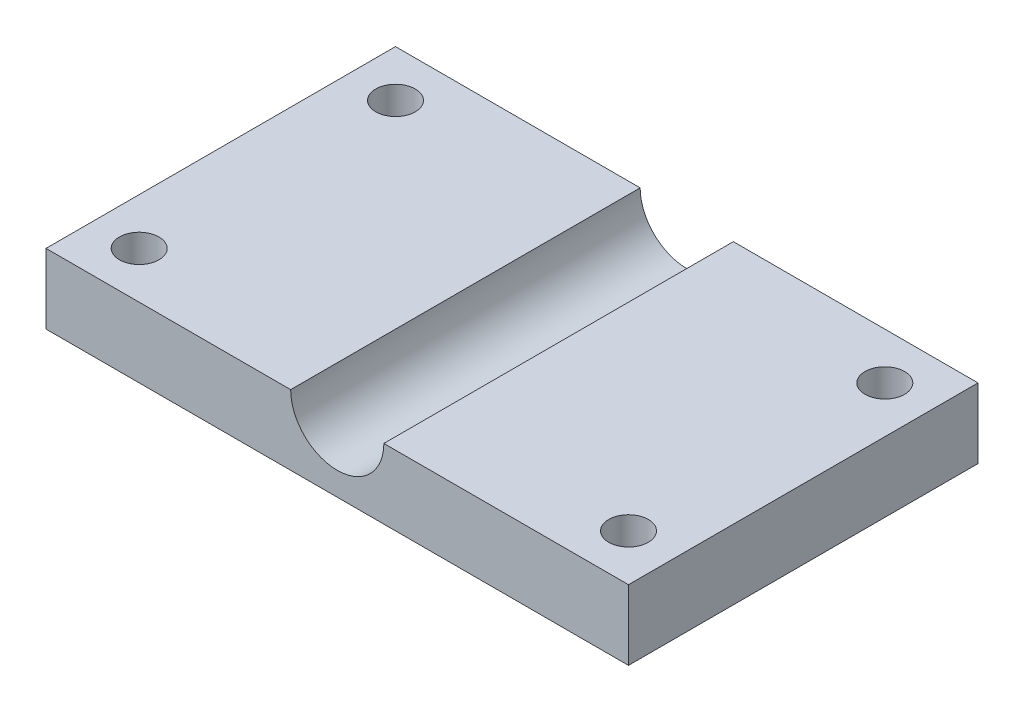
ISO-10303-21;
HEADER;
FILE_DESCRIPTION(('STEP AP214'),'2;1');
FILE_NAME('part.step','',(''),(''),'','','');
FILE_SCHEMA(('AUTOMOTIVE_DESIGN { 1 0 10303 214 1 1 1 1 }'));
ENDSEC;
DATA;
#1=APPLICATION_CONTEXT('core data for automotive mechanical design processes');
#2=APPLICATION_PROTOCOL_DEFINITION('international standard','automotive_design',2000,#1);
#3=PRODUCT_CONTEXT('',#1,'mechanical');
#4=PRODUCT('Part','Part','',(#3));
#5=PRODUCT_RELATED_PRODUCT_CATEGORY('part','',(#4));
#6=PRODUCT_DEFINITION_FORMATION('','',#4);
#7=PRODUCT_DEFINITION_CONTEXT('part definition',#1,'design');
#8=PRODUCT_DEFINITION('design','',#6,#7);
#9=PRODUCT_DEFINITION_SHAPE('','',#8);
#10=(LENGTH_UNIT() NAMED_UNIT(*) SI_UNIT(.MILLI.,.METRE.));
#11=(NAMED_UNIT(*) PLANE_ANGLE_UNIT() SI_UNIT($,.RADIAN.));
#12=(NAMED_UNIT(*) SI_UNIT($,.STERADIAN.) SOLID_ANGLE_UNIT());
#13=UNCERTAINTY_MEASURE_WITH_UNIT(LENGTH_MEASURE(1.E-05),#10,'distance_accuracy_value','');
#14=(GEOMETRIC_REPRESENTATION_CONTEXT(3) GLOBAL_UNCERTAINTY_ASSIGNED_CONTEXT((#13)) GLOBAL_UNIT_ASSIGNED_CONTEXT((#10,
#11,#12)) REPRESENTATION_CONTEXT('',''));
#15=CARTESIAN_POINT('',(0.,0.,0.));
#16=DIRECTION('',(0.,0.,1.));
#17=DIRECTION('',(1.,0.,0.));
#18=AXIS2_PLACEMENT_3D('',#15,#16,#17);
#19=CARTESIAN_POINT('',(0.,6.,0.));
#20=DIRECTION('',(0.,1.,0.));
#21=DIRECTION('',(0.,0.,1.));
#22=AXIS2_PLACEMENT_3D('',#19,#20,#21);
#23=PLANE('',#22);
#24=CARTESIAN_POINT('',(-17.7437264817021,6.,-11.7035175879397));
#25=DIRECTION('',(0.,1.,0.));
#26=DIRECTION('',(0.,0.,1.));
#27=AXIS2_PLACEMENT_3D('',#24,#25,#26);
#28=CIRCLE('',#27,1.7);
#29=CARTESIAN_POINT('',(-17.7437264817021,6.,-10.0035175879397));
#30=VERTEX_POINT('',#29);
#31=EDGE_CURVE('E208',#30,#30,#28,.T.);
#32=ORIENTED_EDGE('',*,*,#31,.F.);
#33=EDGE_LOOP('',(#32));
#34=FACE_BOUND('',#33,.T.);
#35=CARTESIAN_POINT('',(-17.7437264817021,6.,10.2964824120603));
#36=DIRECTION('',(0.,1.,0.));
#37=DIRECTION('',(0.,0.,1.));
#38=AXIS2_PLACEMENT_3D('',#35,#36,#37);
#39=CIRCLE('',#38,1.7);
#40=CARTESIAN_POINT('',(-17.7437264817021,6.,11.9964824120603));
#41=VERTEX_POINT('',#40);
#42=EDGE_CURVE('E100',#41,#41,#39,.T.);
#43=ORIENTED_EDGE('',*,*,#42,.F.);
#44=EDGE_LOOP('',(#43));
#45=FACE_BOUND('',#44,.T.);
#46=DIRECTION('',(0.,0.,1.));
#47=VECTOR('',#46,1.);
#48=CARTESIAN_POINT('',(-0.743726481702089,6.,-15.7035175879397));
#49=LINE('',#48,#47);
#50=CARTESIAN_POINT('',(-0.743726481702089,6.,-15.7035175879397));
#51=VERTEX_POINT('',#50);
#52=CARTESIAN_POINT('',(-0.743726481702089,6.,14.2964824120603));
#53=VERTEX_POINT('',#52);
#54=EDGE_CURVE('E11',#51,#53,#49,.T.);
#55=ORIENTED_EDGE('',*,*,#54,.F.);
#56=DIRECTION('',(-1.,0.,0.));
#57=VECTOR('',#56,1.);
#58=CARTESIAN_POINT('',(-21.7437264817021,6.,-15.7035175879397));
#59=LINE('',#58,#57);
#60=CARTESIAN_POINT('',(-21.7437264817021,6.,-15.7035175879397));
#61=VERTEX_POINT('',#60);
#62=EDGE_CURVE('E56',#51,#61,#59,.T.);
#63=ORIENTED_EDGE('',*,*,#62,.T.);
#64=DIRECTION('',(0.,0.,1.));
#65=VECTOR('',#64,1.);
#66=CARTESIAN_POINT('',(-21.7437264817021,6.,-15.7035175879397));
#67=LINE('',#66,#65);
#68=CARTESIAN_POINT('',(-21.7437264817021,6.,14.2964824120603));
#69=VERTEX_POINT('',#68);
#70=EDGE_CURVE('E103',#61,#69,#67,.T.);
#71=ORIENTED_EDGE('',*,*,#70,.T.);
#72=DIRECTION('',(1.,0.,0.));
#73=VECTOR('',#72,1.);
#74=CARTESIAN_POINT('',(-21.7437264817021,6.,14.2964824120603));
#75=LINE('',#74,#73);
#76=EDGE_CURVE('E85',#69,#53,#75,.T.);
#77=ORIENTED_EDGE('',*,*,#76,.T.);
#78=EDGE_LOOP('',(#55,#63,#71,#77));
#79=FACE_BOUND('',#78,.T.);
#80=ADVANCED_FACE('F33',(#34,#45,#79),#23,.T.);
#81=CARTESIAN_POINT('',(-21.7437264817021,6.,-15.7035175879397));
#82=DIRECTION('',(1.,0.,0.));
#83=DIRECTION('',(0.,0.,-1.));
#84=AXIS2_PLACEMENT_3D('',#81,#82,#83);
#85=PLANE('',#84);
#86=DIRECTION('',(0.,0.,1.));
#87=VECTOR('',#86,1.);
#88=CARTESIAN_POINT('',(-21.7437264817021,0.,-15.7035175879397));
#89=LINE('',#88,#87);
#90=CARTESIAN_POINT('',(-21.7437264817021,0.,-15.7035175879397));
#91=VERTEX_POINT('',#90);
#92=CARTESIAN_POINT('',(-21.7437264817021,0.,14.2964824120603));
#93=VERTEX_POINT('',#92);
#94=EDGE_CURVE('E114',#91,#93,#89,.T.);
#95=ORIENTED_EDGE('',*,*,#94,.T.);
#96=DIRECTION('',(0.,-1.,0.));
#97=VECTOR('',#96,1.);
#98=CARTESIAN_POINT('',(-21.7437264817021,6.,14.2964824120603));
#99=LINE('',#98,#97);
#100=EDGE_CURVE('E128',#69,#93,#99,.T.);
#101=ORIENTED_EDGE('',*,*,#100,.F.);
#102=ORIENTED_EDGE('',*,*,#70,.F.);
#103=DIRECTION('',(0.,-1.,0.));
#104=VECTOR('',#103,1.);
#105=CARTESIAN_POINT('',(-21.7437264817021,6.,-15.7035175879397));
#106=LINE('',#105,#104);
#107=EDGE_CURVE('E113',#61,#91,#106,.T.);
#108=ORIENTED_EDGE('',*,*,#107,.T.);
#109=EDGE_LOOP('',(#95,#101,#102,#108));
#110=FACE_BOUND('',#109,.T.);
#111=ADVANCED_FACE('F35',(#110),#85,.F.);
#112=CARTESIAN_POINT('',(-21.7437264817021,6.,14.2964824120603));
#113=DIRECTION('',(0.,0.,-1.));
#114=DIRECTION('',(-1.,0.,0.));
#115=AXIS2_PLACEMENT_3D('',#112,#113,#114);
#116=PLANE('',#115);
#117=CARTESIAN_POINT('',(7.25627351829791,6.,14.2964824120603));
#118=VERTEX_POINT('',#117);
#119=CARTESIAN_POINT('',(28.2562735182979,6.,14.2964824120603));
#120=VERTEX_POINT('',#119);
#121=EDGE_CURVE('E99',#118,#120,#75,.T.);
#122=ORIENTED_EDGE('',*,*,#121,.F.);
#123=CARTESIAN_POINT('',(3.25627351829791,6.,14.2964824120603));
#124=DIRECTION('',(0.,0.,1.));
#125=DIRECTION('',(1.,0.,0.));
#126=AXIS2_PLACEMENT_3D('',#123,#124,#125);
#127=CIRCLE('',#126,4.);
#128=EDGE_CURVE('E47',#53,#118,#127,.T.);
#129=ORIENTED_EDGE('',*,*,#128,.F.);
#130=ORIENTED_EDGE('',*,*,#76,.F.);
#131=ORIENTED_EDGE('',*,*,#100,.T.);
#132=DIRECTION('',(1.,0.,0.));
#133=VECTOR('',#132,1.);
#134=CARTESIAN_POINT('',(-21.7437264817021,0.,14.2964824120603));
#135=LINE('',#134,#133);
#136=CARTESIAN_POINT('',(28.2562735182979,0.,14.2964824120603));
#137=VERTEX_POINT('',#136);
#138=EDGE_CURVE('E117',#93,#137,#135,.T.);
#139=ORIENTED_EDGE('',*,*,#138,.T.);
#140=DIRECTION('',(0.,-1.,0.));
#141=VECTOR('',#140,1.);
#142=CARTESIAN_POINT('',(28.2562735182979,6.,14.2964824120603));
#143=LINE('',#142,#141);
#144=EDGE_CURVE('E125',#120,#137,#143,.T.);
#145=ORIENTED_EDGE('',*,*,#144,.F.);
#146=EDGE_LOOP('',(#122,#129,#130,#131,#139,#145));
#147=FACE_BOUND('',#146,.T.);
#148=ADVANCED_FACE('F97',(#147),#116,.F.);
#149=CARTESIAN_POINT('',(28.2562735182979,6.,-15.7035175879397));
#150=DIRECTION('',(-1.,0.,0.));
#151=DIRECTION('',(0.,0.,1.));
#152=AXIS2_PLACEMENT_3D('',#149,#150,#151);
#153=PLANE('',#152);
#154=DIRECTION('',(0.,0.,-1.));
#155=VECTOR('',#154,1.);
#156=CARTESIAN_POINT('',(28.2562735182979,0.,-15.7035175879397));
#157=LINE('',#156,#155);
#158=CARTESIAN_POINT('',(28.2562735182979,0.,-15.7035175879397));
#159=VERTEX_POINT('',#158);
#160=EDGE_CURVE('E119',#137,#159,#157,.T.);
#161=ORIENTED_EDGE('',*,*,#160,.T.);
#162=DIRECTION('',(0.,-1.,0.));
#163=VECTOR('',#162,1.);
#164=CARTESIAN_POINT('',(28.2562735182979,6.,-15.7035175879397));
#165=LINE('',#164,#163);
#166=CARTESIAN_POINT('',(28.2562735182979,6.,-15.7035175879397));
#167=VERTEX_POINT('',#166);
#168=EDGE_CURVE('E123',#167,#159,#165,.T.);
#169=ORIENTED_EDGE('',*,*,#168,.F.);
#170=DIRECTION('',(0.,0.,-1.));
#171=VECTOR('',#170,1.);
#172=CARTESIAN_POINT('',(28.2562735182979,6.,-15.7035175879397));
#173=LINE('',#172,#171);
#174=EDGE_CURVE('E105',#120,#167,#173,.T.);
#175=ORIENTED_EDGE('',*,*,#174,.F.);
#176=ORIENTED_EDGE('',*,*,#144,.T.);
#177=EDGE_LOOP('',(#161,#169,#175,#176));
#178=FACE_BOUND('',#177,.T.);
#179=ADVANCED_FACE('F137',(#178),#153,.F.);
#180=CARTESIAN_POINT('',(-21.7437264817021,6.,-15.7035175879397));
#181=DIRECTION('',(0.,0.,1.));
#182=DIRECTION('',(1.,0.,0.));
#183=AXIS2_PLACEMENT_3D('',#180,#181,#182);
#184=PLANE('',#183);
#185=ORIENTED_EDGE('',*,*,#62,.F.);
#186=CARTESIAN_POINT('',(3.25627351829791,6.,-15.7035175879397));
#187=DIRECTION('',(0.,0.,1.));
#188=DIRECTION('',(1.,0.,0.));
#189=AXIS2_PLACEMENT_3D('',#186,#187,#188);
#190=CIRCLE('',#189,4.);
#191=CARTESIAN_POINT('',(7.25627351829791,6.,-15.7035175879397));
#192=VERTEX_POINT('',#191);
#193=EDGE_CURVE('E95',#51,#192,#190,.T.);
#194=ORIENTED_EDGE('',*,*,#193,.T.);
#195=EDGE_CURVE('E110',#167,#192,#59,.T.);
#196=ORIENTED_EDGE('',*,*,#195,.F.);
#197=ORIENTED_EDGE('',*,*,#168,.T.);
#198=DIRECTION('',(-1.,0.,0.));
#199=VECTOR('',#198,1.);
#200=CARTESIAN_POINT('',(-21.7437264817021,0.,-15.7035175879397));
#201=LINE('',#200,#199);
#202=EDGE_CURVE('E78',#159,#91,#201,.T.);
#203=ORIENTED_EDGE('',*,*,#202,.T.);
#204=ORIENTED_EDGE('',*,*,#107,.F.);
#205=EDGE_LOOP('',(#185,#194,#196,#197,#203,#204));
#206=FACE_BOUND('',#205,.T.);
#207=ADVANCED_FACE('F131',(#206),#184,.F.);
#208=CARTESIAN_POINT('',(24.2562735182979,6.,-11.7035175879397));
#209=DIRECTION('',(0.,1.,0.));
#210=DIRECTION('',(0.,0.,1.));
#211=AXIS2_PLACEMENT_3D('',#208,#209,#210);
#212=CIRCLE('',#211,1.7);
#213=CARTESIAN_POINT('',(24.2562735182979,6.,-10.0035175879397));
#214=VERTEX_POINT('',#213);
#215=EDGE_CURVE('E167',#214,#214,#212,.T.);
#216=ORIENTED_EDGE('',*,*,#215,.F.);
#217=EDGE_LOOP('',(#216));
#218=FACE_BOUND('',#217,.T.);
#219=CARTESIAN_POINT('',(24.2562735182979,6.,10.2964824120603));
#220=DIRECTION('',(0.,1.,0.));
#221=DIRECTION('',(0.,0.,1.));
#222=AXIS2_PLACEMENT_3D('',#219,#220,#221);
#223=CIRCLE('',#222,1.7);
#224=CARTESIAN_POINT('',(24.2562735182979,6.,11.9964824120603));
#225=VERTEX_POINT('',#224);
#226=EDGE_CURVE('E170',#225,#225,#223,.T.);
#227=ORIENTED_EDGE('',*,*,#226,.F.);
#228=EDGE_LOOP('',(#227));
#229=FACE_BOUND('',#228,.T.);
#230=DIRECTION('',(0.,0.,1.));
#231=VECTOR('',#230,1.);
#232=CARTESIAN_POINT('',(7.25627351829791,6.,-15.7035175879397));
#233=LINE('',#232,#231);
#234=EDGE_CURVE('E41',#118,#192,#233,.F.);
#235=ORIENTED_EDGE('',*,*,#234,.F.);
#236=ORIENTED_EDGE('',*,*,#121,.T.);
#237=ORIENTED_EDGE('',*,*,#174,.T.);
#238=ORIENTED_EDGE('',*,*,#195,.T.);
#239=EDGE_LOOP('',(#235,#236,#237,#238));
#240=FACE_BOUND('',#239,.T.);
#241=ADVANCED_FACE('F133',(#218,#229,#240),#23,.T.);
#242=CARTESIAN_POINT('',(0.,0.,0.));
#243=DIRECTION('',(0.,1.,0.));
#244=DIRECTION('',(0.,0.,1.));
#245=AXIS2_PLACEMENT_3D('',#242,#243,#244);
#246=PLANE('',#245);
#247=CARTESIAN_POINT('',(-17.7437264817021,0.,-11.7035175879397));
#248=DIRECTION('',(0.,-1.,0.));
#249=DIRECTION('',(0.,0.,1.));
#250=AXIS2_PLACEMENT_3D('',#247,#248,#249);
#251=CIRCLE('',#250,1.7);
#252=CARTESIAN_POINT('',(-17.7437264817021,0.,-10.0035175879397));
#253=VERTEX_POINT('',#252);
#254=EDGE_CURVE('E211',#253,#253,#251,.T.);
#255=ORIENTED_EDGE('',*,*,#254,.F.);
#256=EDGE_LOOP('',(#255));
#257=FACE_BOUND('',#256,.T.);
#258=CARTESIAN_POINT('',(24.2562735182979,0.,-11.7035175879397));
#259=DIRECTION('',(0.,-1.,0.));
#260=DIRECTION('',(0.,0.,-1.));
#261=AXIS2_PLACEMENT_3D('',#258,#259,#260);
#262=CIRCLE('',#261,1.7);
#263=CARTESIAN_POINT('',(24.2562735182979,0.,-13.4035175879397));
#264=VERTEX_POINT('',#263);
#265=EDGE_CURVE('E213',#264,#264,#262,.T.);
#266=ORIENTED_EDGE('',*,*,#265,.F.);
#267=EDGE_LOOP('',(#266));
#268=FACE_BOUND('',#267,.T.);
#269=CARTESIAN_POINT('',(24.2562735182979,0.,10.2964824120603));
#270=DIRECTION('',(0.,-1.,0.));
#271=DIRECTION('',(0.,0.,1.));
#272=AXIS2_PLACEMENT_3D('',#269,#270,#271);
#273=CIRCLE('',#272,1.7);
#274=CARTESIAN_POINT('',(24.2562735182979,0.,11.9964824120603));
#275=VERTEX_POINT('',#274);
#276=EDGE_CURVE('E173',#275,#275,#273,.T.);
#277=ORIENTED_EDGE('',*,*,#276,.F.);
#278=EDGE_LOOP('',(#277));
#279=FACE_BOUND('',#278,.T.);
#280=CARTESIAN_POINT('',(-17.7437264817021,0.,10.2964824120603));
#281=DIRECTION('',(0.,-1.,0.));
#282=DIRECTION('',(0.,0.,-1.));
#283=AXIS2_PLACEMENT_3D('',#280,#281,#282);
#284=CIRCLE('',#283,1.7);
#285=CARTESIAN_POINT('',(-17.7437264817021,0.,8.5964824120603));
#286=VERTEX_POINT('',#285);
#287=EDGE_CURVE('E172',#286,#286,#284,.T.);
#288=ORIENTED_EDGE('',*,*,#287,.F.);
#289=EDGE_LOOP('',(#288));
#290=FACE_BOUND('',#289,.T.);
#291=ORIENTED_EDGE('',*,*,#94,.F.);
#292=ORIENTED_EDGE('',*,*,#202,.F.);
#293=ORIENTED_EDGE('',*,*,#160,.F.);
#294=ORIENTED_EDGE('',*,*,#138,.F.);
#295=EDGE_LOOP('',(#291,#292,#293,#294));
#296=FACE_BOUND('',#295,.T.);
#297=ADVANCED_FACE('F141',(#257,#268,#279,#290,#296),#246,.F.);
#298=CARTESIAN_POINT('',(3.25627351829791,6.,-15.7035175879397));
#299=DIRECTION('',(0.,0.,1.));
#300=DIRECTION('',(1.,0.,0.));
#301=AXIS2_PLACEMENT_3D('',#298,#299,#300);
#302=CYLINDRICAL_SURFACE('',#301,4.);
#303=ORIENTED_EDGE('',*,*,#54,.T.);
#304=ORIENTED_EDGE('',*,*,#128,.T.);
#305=ORIENTED_EDGE('',*,*,#234,.T.);
#306=ORIENTED_EDGE('',*,*,#193,.F.);
#307=EDGE_LOOP('',(#303,#304,#305,#306));
#308=FACE_BOUND('',#307,.T.);
#309=ADVANCED_FACE('F93',(#308),#302,.F.);
#310=CARTESIAN_POINT('',(-17.7437264817021,10.,10.2964824120603));
#311=DIRECTION('',(0.,-1.,0.));
#312=DIRECTION('',(0.,0.,-1.));
#313=AXIS2_PLACEMENT_3D('',#310,#311,#312);
#314=CYLINDRICAL_SURFACE('',#313,1.7);
#315=ORIENTED_EDGE('',*,*,#42,.T.);
#316=EDGE_LOOP('',(#315));
#317=FACE_BOUND('',#316,.T.);
#318=ORIENTED_EDGE('',*,*,#287,.T.);
#319=EDGE_LOOP('',(#318));
#320=FACE_BOUND('',#319,.T.);
#321=ADVANCED_FACE('F184',(#317,#320),#314,.F.);
#322=CARTESIAN_POINT('',(24.2562735182979,10.,10.2964824120603));
#323=DIRECTION('',(0.,-1.,0.));
#324=DIRECTION('',(0.,0.,-1.));
#325=AXIS2_PLACEMENT_3D('',#322,#323,#324);
#326=CYLINDRICAL_SURFACE('',#325,1.7);
#327=ORIENTED_EDGE('',*,*,#226,.T.);
#328=EDGE_LOOP('',(#327));
#329=FACE_BOUND('',#328,.T.);
#330=ORIENTED_EDGE('',*,*,#276,.T.);
#331=EDGE_LOOP('',(#330));
#332=FACE_BOUND('',#331,.T.);
#333=ADVANCED_FACE('F187',(#329,#332),#326,.F.);
#334=CARTESIAN_POINT('',(24.2562735182979,10.,-11.7035175879397));
#335=DIRECTION('',(0.,-1.,0.));
#336=DIRECTION('',(0.,0.,-1.));
#337=AXIS2_PLACEMENT_3D('',#334,#335,#336);
#338=CYLINDRICAL_SURFACE('',#337,1.7);
#339=ORIENTED_EDGE('',*,*,#215,.T.);
#340=EDGE_LOOP('',(#339));
#341=FACE_BOUND('',#340,.T.);
#342=ORIENTED_EDGE('',*,*,#265,.T.);
#343=EDGE_LOOP('',(#342));
#344=FACE_BOUND('',#343,.T.);
#345=ADVANCED_FACE('F195',(#341,#344),#338,.F.);
#346=CARTESIAN_POINT('',(-17.7437264817021,10.,-11.7035175879397));
#347=DIRECTION('',(0.,-1.,0.));
#348=DIRECTION('',(0.,0.,-1.));
#349=AXIS2_PLACEMENT_3D('',#346,#347,#348);
#350=CYLINDRICAL_SURFACE('',#349,1.7);
#351=ORIENTED_EDGE('',*,*,#31,.T.);
#352=EDGE_LOOP('',(#351));
#353=FACE_BOUND('',#352,.T.);
#354=ORIENTED_EDGE('',*,*,#254,.T.);
#355=EDGE_LOOP('',(#354));
#356=FACE_BOUND('',#355,.T.);
#357=ADVANCED_FACE('F200',(#353,#356),#350,.F.);
#358=CLOSED_SHELL('',(#80,#111,#148,#179,#207,#241,#297,#309,#321,#333,#345,#357));
#359=MANIFOLD_SOLID_BREP('B2',#358);
#360=ADVANCED_BREP_SHAPE_REPRESENTATION('',(#18,#359),#14);
#361=SHAPE_DEFINITION_REPRESENTATION(#9,#360);
ENDSEC;
END-ISO-10303-21;
